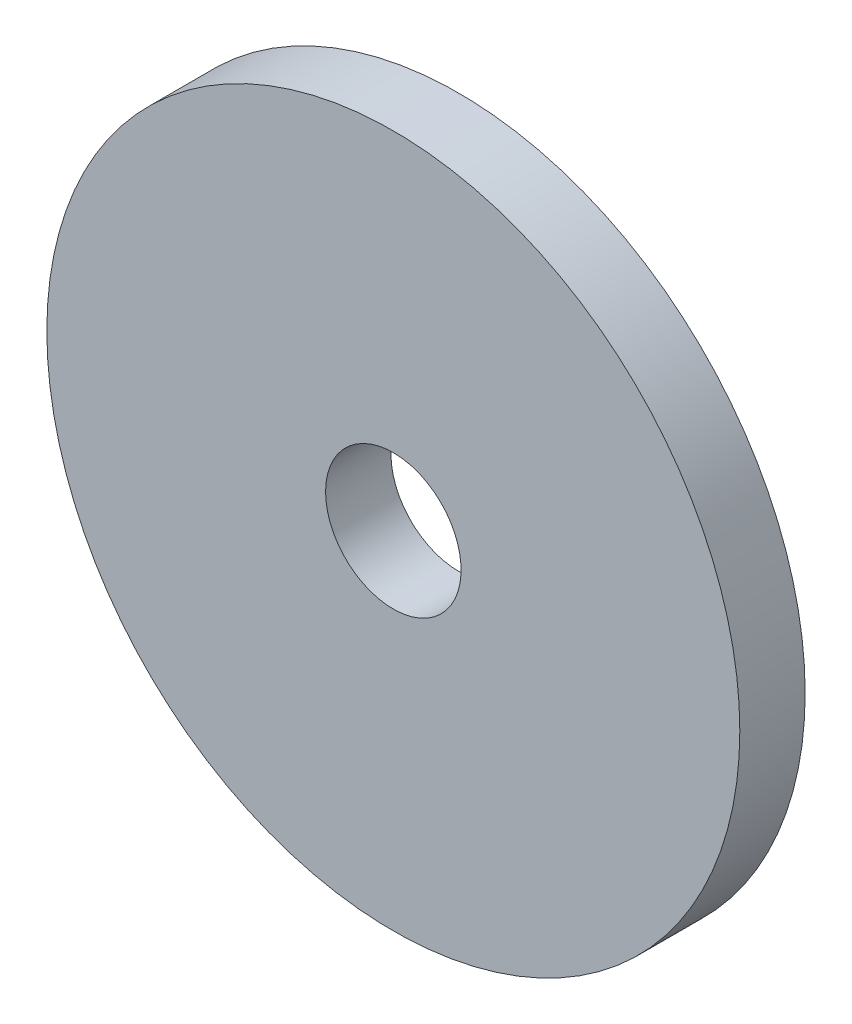
ISO-10303-21;
HEADER;
FILE_DESCRIPTION(('STEP AP214'),'2;1');
FILE_NAME('part.step','',(''),(''),'','','');
FILE_SCHEMA(('AUTOMOTIVE_DESIGN { 1 0 10303 214 1 1 1 1 }'));
ENDSEC;
DATA;
#1=APPLICATION_CONTEXT('core data for automotive mechanical design processes');
#2=APPLICATION_PROTOCOL_DEFINITION('international standard','automotive_design',2000,#1);
#3=PRODUCT_CONTEXT('',#1,'mechanical');
#4=PRODUCT('Part','Part','',(#3));
#5=PRODUCT_RELATED_PRODUCT_CATEGORY('part','',(#4));
#6=PRODUCT_DEFINITION_FORMATION('','',#4);
#7=PRODUCT_DEFINITION_CONTEXT('part definition',#1,'design');
#8=PRODUCT_DEFINITION('design','',#6,#7);
#9=PRODUCT_DEFINITION_SHAPE('','',#8);
#10=(LENGTH_UNIT() NAMED_UNIT(*) SI_UNIT(.MILLI.,.METRE.));
#11=(NAMED_UNIT(*) PLANE_ANGLE_UNIT() SI_UNIT($,.RADIAN.));
#12=(NAMED_UNIT(*) SI_UNIT($,.STERADIAN.) SOLID_ANGLE_UNIT());
#13=UNCERTAINTY_MEASURE_WITH_UNIT(LENGTH_MEASURE(1.E-05),#10,'distance_accuracy_value','');
#14=(GEOMETRIC_REPRESENTATION_CONTEXT(3) GLOBAL_UNCERTAINTY_ASSIGNED_CONTEXT((#13)) GLOBAL_UNIT_ASSIGNED_CONTEXT((#10,
#11,#12)) REPRESENTATION_CONTEXT('',''));
#15=CARTESIAN_POINT('',(0.,0.,0.));
#16=DIRECTION('',(0.,0.,1.));
#17=DIRECTION('',(1.,0.,0.));
#18=AXIS2_PLACEMENT_3D('',#15,#16,#17);
#19=CARTESIAN_POINT('',(0.,0.,19.05));
#20=DIRECTION('',(0.,0.,1.));
#21=DIRECTION('',(1.,0.,0.));
#22=AXIS2_PLACEMENT_3D('',#19,#20,#21);
#23=PLANE('',#22);
#24=CARTESIAN_POINT('',(0.,0.,19.05));
#25=DIRECTION('',(0.,0.,1.));
#26=DIRECTION('',(1.,0.,0.));
#27=AXIS2_PLACEMENT_3D('',#24,#25,#26);
#28=CIRCLE('',#27,101.);
#29=CARTESIAN_POINT('',(-101.,0.,19.05));
#30=VERTEX_POINT('',#29);
#31=EDGE_CURVE('E10',#30,#30,#28,.T.);
#32=ORIENTED_EDGE('',*,*,#31,.T.);
#33=EDGE_LOOP('',(#32));
#34=FACE_BOUND('',#33,.T.);
#35=CARTESIAN_POINT('',(0.,0.,19.05));
#36=DIRECTION('',(0.,0.,1.));
#37=DIRECTION('',(1.,0.,0.));
#38=AXIS2_PLACEMENT_3D('',#35,#36,#37);
#39=CIRCLE('',#38,19.747025761427);
#40=CARTESIAN_POINT('',(-19.747025761427,0.,19.05));
#41=VERTEX_POINT('',#40);
#42=EDGE_CURVE('E54',#41,#41,#39,.T.);
#43=ORIENTED_EDGE('',*,*,#42,.F.);
#44=EDGE_LOOP('',(#43));
#45=FACE_BOUND('',#44,.T.);
#46=ADVANCED_FACE('F43',(#34,#45),#23,.T.);
#47=CARTESIAN_POINT('',(0.,0.,0.));
#48=DIRECTION('',(0.,0.,1.));
#49=DIRECTION('',(1.,0.,0.));
#50=AXIS2_PLACEMENT_3D('',#47,#48,#49);
#51=PLANE('',#50);
#52=CARTESIAN_POINT('',(0.,0.,0.));
#53=DIRECTION('',(0.,0.,1.));
#54=DIRECTION('',(1.,0.,0.));
#55=AXIS2_PLACEMENT_3D('',#52,#53,#54);
#56=CIRCLE('',#55,101.);
#57=CARTESIAN_POINT('',(-101.,0.,0.));
#58=VERTEX_POINT('',#57);
#59=EDGE_CURVE('E47',#58,#58,#56,.T.);
#60=ORIENTED_EDGE('',*,*,#59,.F.);
#61=EDGE_LOOP('',(#60));
#62=FACE_BOUND('',#61,.T.);
#63=CARTESIAN_POINT('',(0.,0.,0.));
#64=DIRECTION('',(0.,0.,1.));
#65=DIRECTION('',(1.,0.,0.));
#66=AXIS2_PLACEMENT_3D('',#63,#64,#65);
#67=CIRCLE('',#66,19.747025761427);
#68=CARTESIAN_POINT('',(-19.747025761427,0.,0.));
#69=VERTEX_POINT('',#68);
#70=EDGE_CURVE('E56',#69,#69,#67,.T.);
#71=ORIENTED_EDGE('',*,*,#70,.T.);
#72=EDGE_LOOP('',(#71));
#73=FACE_BOUND('',#72,.T.);
#74=ADVANCED_FACE('F66',(#62,#73),#51,.F.);
#75=CARTESIAN_POINT('',(0.,0.,19.05));
#76=DIRECTION('',(0.,0.,-1.));
#77=DIRECTION('',(-1.,0.,0.));
#78=AXIS2_PLACEMENT_3D('',#75,#76,#77);
#79=CYLINDRICAL_SURFACE('',#78,101.);
#80=CARTESIAN_POINT('',(-101.,0.,19.05));
#81=CARTESIAN_POINT('',(-101.,0.,18.8515625));
#82=CARTESIAN_POINT('',(-101.,0.,18.653125));
#83=CARTESIAN_POINT('',(-101.,0.,18.25625));
#84=CARTESIAN_POINT('',(-101.,0.,18.0578125));
#85=CARTESIAN_POINT('',(-101.,0.,17.6609375));
#86=CARTESIAN_POINT('',(-101.,0.,17.4625));
#87=CARTESIAN_POINT('',(-101.,0.,17.065625));
#88=CARTESIAN_POINT('',(-101.,0.,16.8671875));
#89=CARTESIAN_POINT('',(-101.,0.,16.4703125));
#90=CARTESIAN_POINT('',(-101.,0.,16.271875));
#91=CARTESIAN_POINT('',(-101.,0.,15.875));
#92=CARTESIAN_POINT('',(-101.,0.,15.6765625));
#93=CARTESIAN_POINT('',(-101.,0.,15.2796875));
#94=CARTESIAN_POINT('',(-101.,0.,15.08125));
#95=CARTESIAN_POINT('',(-101.,0.,14.684375));
#96=CARTESIAN_POINT('',(-101.,0.,14.4859375));
#97=CARTESIAN_POINT('',(-101.,0.,14.0890625));
#98=CARTESIAN_POINT('',(-101.,0.,13.890625));
#99=CARTESIAN_POINT('',(-101.,0.,13.49375));
#100=CARTESIAN_POINT('',(-101.,0.,13.2953125));
#101=CARTESIAN_POINT('',(-101.,0.,12.8984375));
#102=CARTESIAN_POINT('',(-101.,0.,12.7));
#103=CARTESIAN_POINT('',(-101.,0.,12.303125));
#104=CARTESIAN_POINT('',(-101.,0.,12.1046875));
#105=CARTESIAN_POINT('',(-101.,0.,11.7078125));
#106=CARTESIAN_POINT('',(-101.,0.,11.509375));
#107=CARTESIAN_POINT('',(-101.,0.,11.1125));
#108=CARTESIAN_POINT('',(-101.,0.,10.9140625));
#109=CARTESIAN_POINT('',(-101.,0.,10.5171875));
#110=CARTESIAN_POINT('',(-101.,0.,10.31875));
#111=CARTESIAN_POINT('',(-101.,0.,9.921875));
#112=CARTESIAN_POINT('',(-101.,0.,9.7234375));
#113=CARTESIAN_POINT('',(-101.,0.,9.3265625));
#114=CARTESIAN_POINT('',(-101.,0.,9.128125));
#115=CARTESIAN_POINT('',(-101.,0.,8.73125));
#116=CARTESIAN_POINT('',(-101.,0.,8.5328125));
#117=CARTESIAN_POINT('',(-101.,0.,8.1359375));
#118=CARTESIAN_POINT('',(-101.,0.,7.9375));
#119=CARTESIAN_POINT('',(-101.,0.,7.540625));
#120=CARTESIAN_POINT('',(-101.,0.,7.3421875));
#121=CARTESIAN_POINT('',(-101.,0.,6.9453125));
#122=CARTESIAN_POINT('',(-101.,0.,6.746875));
#123=CARTESIAN_POINT('',(-101.,0.,6.35));
#124=CARTESIAN_POINT('',(-101.,0.,6.1515625));
#125=CARTESIAN_POINT('',(-101.,0.,5.7546875));
#126=CARTESIAN_POINT('',(-101.,0.,5.55625));
#127=CARTESIAN_POINT('',(-101.,0.,5.159375));
#128=CARTESIAN_POINT('',(-101.,0.,4.9609375));
#129=CARTESIAN_POINT('',(-101.,0.,4.5640625));
#130=CARTESIAN_POINT('',(-101.,0.,4.365625));
#131=CARTESIAN_POINT('',(-101.,0.,3.96875));
#132=CARTESIAN_POINT('',(-101.,0.,3.7703125));
#133=CARTESIAN_POINT('',(-101.,0.,3.3734375));
#134=CARTESIAN_POINT('',(-101.,0.,3.175));
#135=CARTESIAN_POINT('',(-101.,0.,2.778125));
#136=CARTESIAN_POINT('',(-101.,0.,2.5796875));
#137=CARTESIAN_POINT('',(-101.,0.,2.1828125));
#138=CARTESIAN_POINT('',(-101.,0.,1.984375));
#139=CARTESIAN_POINT('',(-101.,0.,1.5875));
#140=CARTESIAN_POINT('',(-101.,0.,1.3890625));
#141=CARTESIAN_POINT('',(-101.,0.,0.992187500000001));
#142=CARTESIAN_POINT('',(-101.,0.,0.793750000000001));
#143=CARTESIAN_POINT('',(-101.,0.,0.396875));
#144=CARTESIAN_POINT('',(-101.,0.,0.1984375));
#145=CARTESIAN_POINT('',(-101.,0.,0.));
#146=B_SPLINE_CURVE_WITH_KNOTS('',3,(#80,#81,#82,#83,#84,#85,#86,#87,#88,#89,#90,#91,#92,#93,
#94,#95,#96,#97,#98,#99,#100,#101,#102,#103,#104,#105,#106,#107,#108,#109,#110,#111,#112,#113,
#114,#115,#116,#117,#118,#119,#120,#121,#122,#123,#124,#125,#126,#127,#128,#129,#130,#131,#132,
#133,#134,#135,#136,#137,#138,#139,#140,#141,#142,#143,#144,#145),.UNSPECIFIED.,.F.,.F.,(4,2,2,
2,2,2,2,2,2,2,2,2,2,2,2,2,2,2,2,2,2,2,2,2,2,2,2,2,2,2,2,2,4),(0.,0.595312499999997,1.190625,
1.7859375,2.38125,2.9765625,3.571875,4.1671875,4.7625,5.3578125,5.953125,6.5484375,7.14375,
7.7390625,8.334375,8.9296875,9.525,10.1203125,10.715625,11.3109375,11.90625,12.5015625,
13.096875,13.6921875,14.2875,14.8828125,15.478125,16.0734375,16.66875,17.2640625,17.859375,
18.4546875,19.05),.UNSPECIFIED.);
#147=EDGE_CURVE('BSEAM45',#30,#58,#146,.T.);
#148=ORIENTED_EDGE('',*,*,#31,.F.);
#149=ORIENTED_EDGE('',*,*,#59,.T.);
#150=ORIENTED_EDGE('',*,*,#147,.T.);
#151=ORIENTED_EDGE('',*,*,#147,.F.);
#152=EDGE_LOOP('',(#148,#150,#149,#151));
#153=FACE_BOUND('',#152,.T.);
#154=ADVANCED_FACE('F45',(#153),#79,.T.);
#155=CARTESIAN_POINT('',(0.,0.,19.05));
#156=DIRECTION('',(0.,0.,-1.));
#157=DIRECTION('',(-1.,0.,0.));
#158=AXIS2_PLACEMENT_3D('',#155,#156,#157);
#159=CYLINDRICAL_SURFACE('',#158,19.747025761427);
#160=CARTESIAN_POINT('',(-19.747025761427,0.,19.05));
#161=CARTESIAN_POINT('',(-19.747025761427,0.,18.8515625));
#162=CARTESIAN_POINT('',(-19.747025761427,0.,18.653125));
#163=CARTESIAN_POINT('',(-19.747025761427,0.,18.25625));
#164=CARTESIAN_POINT('',(-19.747025761427,0.,18.0578125));
#165=CARTESIAN_POINT('',(-19.747025761427,0.,17.6609375));
#166=CARTESIAN_POINT('',(-19.747025761427,0.,17.4625));
#167=CARTESIAN_POINT('',(-19.747025761427,0.,17.065625));
#168=CARTESIAN_POINT('',(-19.747025761427,0.,16.8671875));
#169=CARTESIAN_POINT('',(-19.747025761427,0.,16.4703125));
#170=CARTESIAN_POINT('',(-19.747025761427,0.,16.271875));
#171=CARTESIAN_POINT('',(-19.747025761427,0.,15.875));
#172=CARTESIAN_POINT('',(-19.747025761427,0.,15.6765625));
#173=CARTESIAN_POINT('',(-19.747025761427,0.,15.2796875));
#174=CARTESIAN_POINT('',(-19.747025761427,0.,15.08125));
#175=CARTESIAN_POINT('',(-19.747025761427,0.,14.684375));
#176=CARTESIAN_POINT('',(-19.747025761427,0.,14.4859375));
#177=CARTESIAN_POINT('',(-19.747025761427,0.,14.0890625));
#178=CARTESIAN_POINT('',(-19.747025761427,0.,13.890625));
#179=CARTESIAN_POINT('',(-19.747025761427,0.,13.49375));
#180=CARTESIAN_POINT('',(-19.747025761427,0.,13.2953125));
#181=CARTESIAN_POINT('',(-19.747025761427,0.,12.8984375));
#182=CARTESIAN_POINT('',(-19.747025761427,0.,12.7));
#183=CARTESIAN_POINT('',(-19.747025761427,0.,12.303125));
#184=CARTESIAN_POINT('',(-19.747025761427,0.,12.1046875));
#185=CARTESIAN_POINT('',(-19.747025761427,0.,11.7078125));
#186=CARTESIAN_POINT('',(-19.747025761427,0.,11.509375));
#187=CARTESIAN_POINT('',(-19.747025761427,0.,11.1125));
#188=CARTESIAN_POINT('',(-19.747025761427,0.,10.9140625));
#189=CARTESIAN_POINT('',(-19.747025761427,0.,10.5171875));
#190=CARTESIAN_POINT('',(-19.747025761427,0.,10.31875));
#191=CARTESIAN_POINT('',(-19.747025761427,0.,9.921875));
#192=CARTESIAN_POINT('',(-19.747025761427,0.,9.7234375));
#193=CARTESIAN_POINT('',(-19.747025761427,0.,9.3265625));
#194=CARTESIAN_POINT('',(-19.747025761427,0.,9.128125));
#195=CARTESIAN_POINT('',(-19.747025761427,0.,8.73125));
#196=CARTESIAN_POINT('',(-19.747025761427,0.,8.5328125));
#197=CARTESIAN_POINT('',(-19.747025761427,0.,8.1359375));
#198=CARTESIAN_POINT('',(-19.747025761427,0.,7.9375));
#199=CARTESIAN_POINT('',(-19.747025761427,0.,7.540625));
#200=CARTESIAN_POINT('',(-19.747025761427,0.,7.3421875));
#201=CARTESIAN_POINT('',(-19.747025761427,0.,6.9453125));
#202=CARTESIAN_POINT('',(-19.747025761427,0.,6.746875));
#203=CARTESIAN_POINT('',(-19.747025761427,0.,6.35));
#204=CARTESIAN_POINT('',(-19.747025761427,0.,6.1515625));
#205=CARTESIAN_POINT('',(-19.747025761427,0.,5.7546875));
#206=CARTESIAN_POINT('',(-19.747025761427,0.,5.55625));
#207=CARTESIAN_POINT('',(-19.747025761427,0.,5.159375));
#208=CARTESIAN_POINT('',(-19.747025761427,0.,4.9609375));
#209=CARTESIAN_POINT('',(-19.747025761427,0.,4.5640625));
#210=CARTESIAN_POINT('',(-19.747025761427,0.,4.365625));
#211=CARTESIAN_POINT('',(-19.747025761427,0.,3.96875));
#212=CARTESIAN_POINT('',(-19.747025761427,0.,3.7703125));
#213=CARTESIAN_POINT('',(-19.747025761427,0.,3.3734375));
#214=CARTESIAN_POINT('',(-19.747025761427,0.,3.175));
#215=CARTESIAN_POINT('',(-19.747025761427,0.,2.778125));
#216=CARTESIAN_POINT('',(-19.747025761427,0.,2.5796875));
#217=CARTESIAN_POINT('',(-19.747025761427,0.,2.1828125));
#218=CARTESIAN_POINT('',(-19.747025761427,0.,1.984375));
#219=CARTESIAN_POINT('',(-19.747025761427,0.,1.5875));
#220=CARTESIAN_POINT('',(-19.747025761427,0.,1.3890625));
#221=CARTESIAN_POINT('',(-19.747025761427,0.,0.992187500000001));
#222=CARTESIAN_POINT('',(-19.747025761427,0.,0.793750000000001));
#223=CARTESIAN_POINT('',(-19.747025761427,0.,0.396875));
#224=CARTESIAN_POINT('',(-19.747025761427,0.,0.1984375));
#225=CARTESIAN_POINT('',(-19.747025761427,0.,0.));
#226=B_SPLINE_CURVE_WITH_KNOTS('',3,(#160,#161,#162,#163,#164,#165,#166,#167,#168,#169,#170,
#171,#172,#173,#174,#175,#176,#177,#178,#179,#180,#181,#182,#183,#184,#185,#186,#187,#188,#189,
#190,#191,#192,#193,#194,#195,#196,#197,#198,#199,#200,#201,#202,#203,#204,#205,#206,#207,#208,
#209,#210,#211,#212,#213,#214,#215,#216,#217,#218,#219,#220,#221,#222,#223,#224,#225),
.UNSPECIFIED.,.F.,.F.,(4,2,2,2,2,2,2,2,2,2,2,2,2,2,2,2,2,2,2,2,2,2,2,2,2,2,2,2,2,2,2,2,4),(0.,
0.5953125,1.190625,1.7859375,2.38125,2.9765625,3.571875,4.1671875,4.7625,5.3578125,5.953125,
6.5484375,7.14375,7.7390625,8.334375,8.9296875,9.525,10.1203125,10.715625,11.3109375,11.90625,
12.5015625,13.096875,13.6921875,14.2875,14.8828125,15.478125,16.0734375,16.66875,17.2640625,
17.859375,18.4546875,19.05),.UNSPECIFIED.);
#227=EDGE_CURVE('BSEAM62',#41,#69,#226,.T.);
#228=ORIENTED_EDGE('',*,*,#42,.T.);
#229=ORIENTED_EDGE('',*,*,#70,.F.);
#230=ORIENTED_EDGE('',*,*,#227,.T.);
#231=ORIENTED_EDGE('',*,*,#227,.F.);
#232=EDGE_LOOP('',(#228,#230,#229,#231));
#233=FACE_BOUND('',#232,.T.);
#234=ADVANCED_FACE('F62',(#233),#159,.F.);
#235=CLOSED_SHELL('',(#46,#74,#154,#234));
#236=MANIFOLD_SOLID_BREP('B2',#235);
#237=ADVANCED_BREP_SHAPE_REPRESENTATION('',(#18,#236),#14);
#238=SHAPE_DEFINITION_REPRESENTATION(#9,#237);
ENDSEC;
END-ISO-10303-21;
